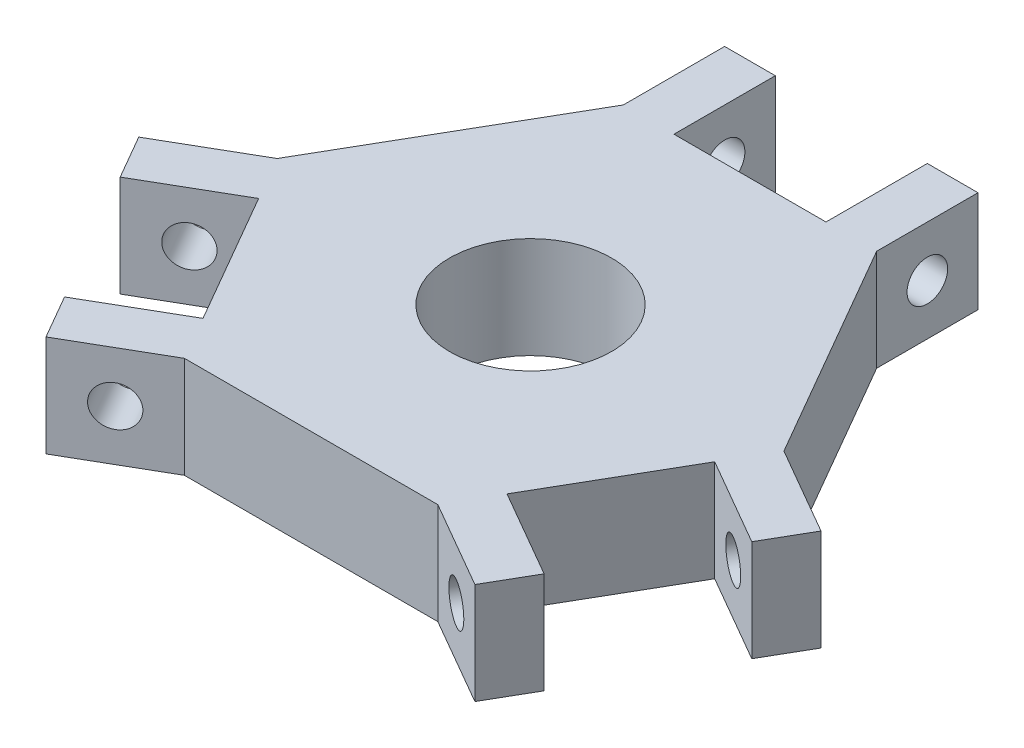
ISO-10303-21;
HEADER;
FILE_DESCRIPTION(('STEP AP214'),'2;1');
FILE_NAME('part.step','',(''),(''),'','','');
FILE_SCHEMA(('AUTOMOTIVE_DESIGN { 1 0 10303 214 1 1 1 1 }'));
ENDSEC;
DATA;
#1=APPLICATION_CONTEXT('core data for automotive mechanical design processes');
#2=APPLICATION_PROTOCOL_DEFINITION('international standard','automotive_design',2000,#1);
#3=PRODUCT_CONTEXT('',#1,'mechanical');
#4=PRODUCT('Part','Part','',(#3));
#5=PRODUCT_RELATED_PRODUCT_CATEGORY('part','',(#4));
#6=PRODUCT_DEFINITION_FORMATION('','',#4);
#7=PRODUCT_DEFINITION_CONTEXT('part definition',#1,'design');
#8=PRODUCT_DEFINITION('design','',#6,#7);
#9=PRODUCT_DEFINITION_SHAPE('','',#8);
#10=(LENGTH_UNIT() NAMED_UNIT(*) SI_UNIT(.MILLI.,.METRE.));
#11=(NAMED_UNIT(*) PLANE_ANGLE_UNIT() SI_UNIT($,.RADIAN.));
#12=(NAMED_UNIT(*) SI_UNIT($,.STERADIAN.) SOLID_ANGLE_UNIT());
#13=UNCERTAINTY_MEASURE_WITH_UNIT(LENGTH_MEASURE(1.E-05),#10,'distance_accuracy_value','');
#14=(GEOMETRIC_REPRESENTATION_CONTEXT(3) GLOBAL_UNCERTAINTY_ASSIGNED_CONTEXT((#13)) GLOBAL_UNIT_ASSIGNED_CONTEXT((#10,
#11,#12)) REPRESENTATION_CONTEXT('',''));
#15=CARTESIAN_POINT('',(0.,0.,0.));
#16=DIRECTION('',(0.,0.,1.));
#17=DIRECTION('',(1.,0.,0.));
#18=AXIS2_PLACEMENT_3D('',#15,#16,#17);
#19=CARTESIAN_POINT('',(18.75,5.,-10.8253175473055));
#20=DIRECTION('',(-0.866025403784439,0.,0.5));
#21=DIRECTION('',(0.5,0.,0.866025403784439));
#22=AXIS2_PLACEMENT_3D('',#19,#20,#21);
#23=PLANE('',#22);
#24=DIRECTION('',(-0.5,0.,-0.866025403784439));
#25=VECTOR('',#24,1.);
#26=CARTESIAN_POINT('',(18.75,-5.,-10.8253175473055));
#27=LINE('',#26,#25);
#28=CARTESIAN_POINT('',(25.,-5.,0.));
#29=VERTEX_POINT('',#28);
#30=CARTESIAN_POINT('',(12.5,-5.,-21.650635094611));
#31=VERTEX_POINT('',#30);
#32=EDGE_CURVE('E234',#29,#31,#27,.T.);
#33=ORIENTED_EDGE('',*,*,#32,.T.);
#34=DIRECTION('',(0.,-1.,0.));
#35=VECTOR('',#34,1.);
#36=CARTESIAN_POINT('',(12.5,5.,-21.650635094611));
#37=LINE('',#36,#35);
#38=CARTESIAN_POINT('',(12.5,5.,-21.650635094611));
#39=VERTEX_POINT('',#38);
#40=EDGE_CURVE('E11',#39,#31,#37,.T.);
#41=ORIENTED_EDGE('',*,*,#40,.F.);
#42=DIRECTION('',(-0.5,0.,-0.866025403784439));
#43=VECTOR('',#42,1.);
#44=CARTESIAN_POINT('',(18.75,5.,-10.8253175473055));
#45=LINE('',#44,#43);
#46=CARTESIAN_POINT('',(25.,5.,0.));
#47=VERTEX_POINT('',#46);
#48=EDGE_CURVE('E379',#47,#39,#45,.T.);
#49=ORIENTED_EDGE('',*,*,#48,.F.);
#50=DIRECTION('',(0.,-1.,0.));
#51=VECTOR('',#50,1.);
#52=CARTESIAN_POINT('',(25.,5.,0.));
#53=LINE('',#52,#51);
#54=EDGE_CURVE('E53',#47,#29,#53,.T.);
#55=ORIENTED_EDGE('',*,*,#54,.T.);
#56=EDGE_LOOP('',(#33,#41,#49,#55));
#57=FACE_BOUND('',#56,.T.);
#58=ADVANCED_FACE('F34',(#57),#23,.F.);
#59=CARTESIAN_POINT('',(12.5,5.,0.));
#60=DIRECTION('',(-1.,0.,0.));
#61=DIRECTION('',(0.,0.,1.));
#62=AXIS2_PLACEMENT_3D('',#59,#60,#61);
#63=PLANE('',#62);
#64=CARTESIAN_POINT('',(12.5,0.,-26.650635094611));
#65=DIRECTION('',(-1.,0.,0.));
#66=DIRECTION('',(0.,0.,1.));
#67=AXIS2_PLACEMENT_3D('',#64,#65,#66);
#68=CIRCLE('',#67,2.);
#69=CARTESIAN_POINT('',(12.5,0.,-24.650635094611));
#70=VERTEX_POINT('',#69);
#71=EDGE_CURVE('E235',#70,#70,#68,.T.);
#72=ORIENTED_EDGE('',*,*,#71,.T.);
#73=EDGE_LOOP('',(#72));
#74=FACE_BOUND('',#73,.T.);
#75=DIRECTION('',(0.,0.,-1.));
#76=VECTOR('',#75,1.);
#77=CARTESIAN_POINT('',(12.5,-5.,0.));
#78=LINE('',#77,#76);
#79=CARTESIAN_POINT('',(12.5,-5.,-31.650635094611));
#80=VERTEX_POINT('',#79);
#81=EDGE_CURVE('E237',#31,#80,#78,.T.);
#82=ORIENTED_EDGE('',*,*,#81,.T.);
#83=DIRECTION('',(0.,-1.,0.));
#84=VECTOR('',#83,1.);
#85=CARTESIAN_POINT('',(12.5,5.,-31.650635094611));
#86=LINE('',#85,#84);
#87=CARTESIAN_POINT('',(12.5,5.,-31.650635094611));
#88=VERTEX_POINT('',#87);
#89=EDGE_CURVE('E44',#88,#80,#86,.T.);
#90=ORIENTED_EDGE('',*,*,#89,.F.);
#91=DIRECTION('',(0.,0.,-1.));
#92=VECTOR('',#91,1.);
#93=CARTESIAN_POINT('',(12.5,5.,0.));
#94=LINE('',#93,#92);
#95=EDGE_CURVE('E139',#39,#88,#94,.T.);
#96=ORIENTED_EDGE('',*,*,#95,.F.);
#97=ORIENTED_EDGE('',*,*,#40,.T.);
#98=EDGE_LOOP('',(#82,#90,#96,#97));
#99=FACE_BOUND('',#98,.T.);
#100=ADVANCED_FACE('F451',(#74,#99),#63,.F.);
#101=CARTESIAN_POINT('',(0.,5.,-31.650635094611));
#102=DIRECTION('',(0.,0.,1.));
#103=DIRECTION('',(1.,0.,0.));
#104=AXIS2_PLACEMENT_3D('',#101,#102,#103);
#105=PLANE('',#104);
#106=DIRECTION('',(-1.,0.,0.));
#107=VECTOR('',#106,1.);
#108=CARTESIAN_POINT('',(0.,-5.,-31.650635094611));
#109=LINE('',#108,#107);
#110=CARTESIAN_POINT('',(7.5,-5.,-31.650635094611));
#111=VERTEX_POINT('',#110);
#112=EDGE_CURVE('E239',#80,#111,#109,.T.);
#113=ORIENTED_EDGE('',*,*,#112,.T.);
#114=DIRECTION('',(0.,-1.,0.));
#115=VECTOR('',#114,1.);
#116=CARTESIAN_POINT('',(7.5,5.,-31.650635094611));
#117=LINE('',#116,#115);
#118=CARTESIAN_POINT('',(7.5,5.,-31.650635094611));
#119=VERTEX_POINT('',#118);
#120=EDGE_CURVE('E339',#119,#111,#117,.T.);
#121=ORIENTED_EDGE('',*,*,#120,.F.);
#122=DIRECTION('',(-1.,0.,0.));
#123=VECTOR('',#122,1.);
#124=CARTESIAN_POINT('',(0.,5.,-31.650635094611));
#125=LINE('',#124,#123);
#126=EDGE_CURVE('E382',#88,#119,#125,.T.);
#127=ORIENTED_EDGE('',*,*,#126,.F.);
#128=ORIENTED_EDGE('',*,*,#89,.T.);
#129=EDGE_LOOP('',(#113,#121,#127,#128));
#130=FACE_BOUND('',#129,.T.);
#131=ADVANCED_FACE('F455',(#130),#105,.F.);
#132=CARTESIAN_POINT('',(7.5,5.,0.));
#133=DIRECTION('',(-1.,0.,0.));
#134=DIRECTION('',(0.,0.,1.));
#135=AXIS2_PLACEMENT_3D('',#132,#133,#134);
#136=PLANE('',#135);
#137=CARTESIAN_POINT('',(7.5,0.,-26.650635094611));
#138=DIRECTION('',(-1.,0.,0.));
#139=DIRECTION('',(0.,0.,1.));
#140=AXIS2_PLACEMENT_3D('',#137,#138,#139);
#141=CIRCLE('',#140,2.);
#142=CARTESIAN_POINT('',(7.5,0.,-24.650635094611));
#143=VERTEX_POINT('',#142);
#144=EDGE_CURVE('E372',#143,#143,#141,.T.);
#145=ORIENTED_EDGE('',*,*,#144,.F.);
#146=EDGE_LOOP('',(#145));
#147=FACE_BOUND('',#146,.T.);
#148=DIRECTION('',(0.,0.,-1.));
#149=VECTOR('',#148,1.);
#150=CARTESIAN_POINT('',(7.5,-5.,0.));
#151=LINE('',#150,#149);
#152=CARTESIAN_POINT('',(7.5,-5.,-21.650635094611));
#153=VERTEX_POINT('',#152);
#154=EDGE_CURVE('E242',#153,#111,#151,.T.);
#155=ORIENTED_EDGE('',*,*,#154,.F.);
#156=DIRECTION('',(0.,-1.,0.));
#157=VECTOR('',#156,1.);
#158=CARTESIAN_POINT('',(7.5,5.,-21.650635094611));
#159=LINE('',#158,#157);
#160=CARTESIAN_POINT('',(7.5,5.,-21.650635094611));
#161=VERTEX_POINT('',#160);
#162=EDGE_CURVE('E337',#161,#153,#159,.T.);
#163=ORIENTED_EDGE('',*,*,#162,.F.);
#164=DIRECTION('',(0.,0.,-1.));
#165=VECTOR('',#164,1.);
#166=CARTESIAN_POINT('',(7.5,5.,0.));
#167=LINE('',#166,#165);
#168=EDGE_CURVE('E384',#161,#119,#167,.T.);
#169=ORIENTED_EDGE('',*,*,#168,.T.);
#170=ORIENTED_EDGE('',*,*,#120,.T.);
#171=EDGE_LOOP('',(#155,#163,#169,#170));
#172=FACE_BOUND('',#171,.T.);
#173=ADVANCED_FACE('F461',(#147,#172),#136,.T.);
#174=CARTESIAN_POINT('',(0.,5.,-21.650635094611));
#175=DIRECTION('',(0.,0.,1.));
#176=DIRECTION('',(1.,0.,0.));
#177=AXIS2_PLACEMENT_3D('',#174,#175,#176);
#178=PLANE('',#177);
#179=DIRECTION('',(-1.,0.,0.));
#180=VECTOR('',#179,1.);
#181=CARTESIAN_POINT('',(0.,-5.,-21.650635094611));
#182=LINE('',#181,#180);
#183=CARTESIAN_POINT('',(-7.5,-5.,-21.650635094611));
#184=VERTEX_POINT('',#183);
#185=EDGE_CURVE('E245',#153,#184,#182,.T.);
#186=ORIENTED_EDGE('',*,*,#185,.T.);
#187=DIRECTION('',(0.,-1.,0.));
#188=VECTOR('',#187,1.);
#189=CARTESIAN_POINT('',(-7.5,5.,-21.650635094611));
#190=LINE('',#189,#188);
#191=CARTESIAN_POINT('',(-7.5,5.,-21.650635094611));
#192=VERTEX_POINT('',#191);
#193=EDGE_CURVE('E334',#192,#184,#190,.T.);
#194=ORIENTED_EDGE('',*,*,#193,.F.);
#195=DIRECTION('',(-1.,0.,0.));
#196=VECTOR('',#195,1.);
#197=CARTESIAN_POINT('',(0.,5.,-21.650635094611));
#198=LINE('',#197,#196);
#199=EDGE_CURVE('E387',#161,#192,#198,.T.);
#200=ORIENTED_EDGE('',*,*,#199,.F.);
#201=ORIENTED_EDGE('',*,*,#162,.T.);
#202=EDGE_LOOP('',(#186,#194,#200,#201));
#203=FACE_BOUND('',#202,.T.);
#204=ADVANCED_FACE('F465',(#203),#178,.F.);
#205=CARTESIAN_POINT('',(-7.5,5.,0.));
#206=DIRECTION('',(-1.,0.,0.));
#207=DIRECTION('',(0.,0.,1.));
#208=AXIS2_PLACEMENT_3D('',#205,#206,#207);
#209=PLANE('',#208);
#210=CARTESIAN_POINT('',(-7.5,0.,-26.650635094611));
#211=DIRECTION('',(-1.,0.,0.));
#212=DIRECTION('',(0.,0.,1.));
#213=AXIS2_PLACEMENT_3D('',#210,#211,#212);
#214=CIRCLE('',#213,2.);
#215=CARTESIAN_POINT('',(-7.5,0.,-24.650635094611));
#216=VERTEX_POINT('',#215);
#217=EDGE_CURVE('E345',#216,#216,#214,.T.);
#218=ORIENTED_EDGE('',*,*,#217,.T.);
#219=EDGE_LOOP('',(#218));
#220=FACE_BOUND('',#219,.T.);
#221=DIRECTION('',(0.,0.,-1.));
#222=VECTOR('',#221,1.);
#223=CARTESIAN_POINT('',(-7.5,-5.,0.));
#224=LINE('',#223,#222);
#225=CARTESIAN_POINT('',(-7.5,-5.,-31.650635094611));
#226=VERTEX_POINT('',#225);
#227=EDGE_CURVE('E247',#184,#226,#224,.T.);
#228=ORIENTED_EDGE('',*,*,#227,.T.);
#229=DIRECTION('',(0.,-1.,0.));
#230=VECTOR('',#229,1.);
#231=CARTESIAN_POINT('',(-7.5,5.,-31.650635094611));
#232=LINE('',#231,#230);
#233=CARTESIAN_POINT('',(-7.5,5.,-31.650635094611));
#234=VERTEX_POINT('',#233);
#235=EDGE_CURVE('E332',#234,#226,#232,.T.);
#236=ORIENTED_EDGE('',*,*,#235,.F.);
#237=DIRECTION('',(0.,0.,-1.));
#238=VECTOR('',#237,1.);
#239=CARTESIAN_POINT('',(-7.5,5.,0.));
#240=LINE('',#239,#238);
#241=EDGE_CURVE('E389',#192,#234,#240,.T.);
#242=ORIENTED_EDGE('',*,*,#241,.F.);
#243=ORIENTED_EDGE('',*,*,#193,.T.);
#244=EDGE_LOOP('',(#228,#236,#242,#243));
#245=FACE_BOUND('',#244,.T.);
#246=ADVANCED_FACE('F469',(#220,#245),#209,.F.);
#247=CARTESIAN_POINT('',(0.,5.,-31.650635094611));
#248=DIRECTION('',(0.,0.,-1.));
#249=DIRECTION('',(-1.,0.,0.));
#250=AXIS2_PLACEMENT_3D('',#247,#248,#249);
#251=PLANE('',#250);
#252=DIRECTION('',(1.,0.,0.));
#253=VECTOR('',#252,1.);
#254=CARTESIAN_POINT('',(0.,-5.,-31.650635094611));
#255=LINE('',#254,#253);
#256=CARTESIAN_POINT('',(-12.5,-5.,-31.650635094611));
#257=VERTEX_POINT('',#256);
#258=EDGE_CURVE('E250',#257,#226,#255,.T.);
#259=ORIENTED_EDGE('',*,*,#258,.F.);
#260=DIRECTION('',(0.,-1.,0.));
#261=VECTOR('',#260,1.);
#262=CARTESIAN_POINT('',(-12.5,5.,-31.650635094611));
#263=LINE('',#262,#261);
#264=CARTESIAN_POINT('',(-12.5,5.,-31.650635094611));
#265=VERTEX_POINT('',#264);
#266=EDGE_CURVE('E330',#265,#257,#263,.T.);
#267=ORIENTED_EDGE('',*,*,#266,.F.);
#268=DIRECTION('',(1.,0.,0.));
#269=VECTOR('',#268,1.);
#270=CARTESIAN_POINT('',(0.,5.,-31.650635094611));
#271=LINE('',#270,#269);
#272=EDGE_CURVE('E391',#265,#234,#271,.T.);
#273=ORIENTED_EDGE('',*,*,#272,.T.);
#274=ORIENTED_EDGE('',*,*,#235,.T.);
#275=EDGE_LOOP('',(#259,#267,#273,#274));
#276=FACE_BOUND('',#275,.T.);
#277=ADVANCED_FACE('F473',(#276),#251,.T.);
#278=CARTESIAN_POINT('',(-12.5,5.,0.));
#279=DIRECTION('',(-1.,0.,0.));
#280=DIRECTION('',(0.,0.,1.));
#281=AXIS2_PLACEMENT_3D('',#278,#279,#280);
#282=PLANE('',#281);
#283=CARTESIAN_POINT('',(-12.5,0.,-26.650635094611));
#284=DIRECTION('',(-1.,0.,0.));
#285=DIRECTION('',(0.,0.,1.));
#286=AXIS2_PLACEMENT_3D('',#283,#284,#285);
#287=CIRCLE('',#286,2.);
#288=CARTESIAN_POINT('',(-12.5,0.,-24.650635094611));
#289=VERTEX_POINT('',#288);
#290=EDGE_CURVE('E343',#289,#289,#287,.T.);
#291=ORIENTED_EDGE('',*,*,#290,.F.);
#292=EDGE_LOOP('',(#291));
#293=FACE_BOUND('',#292,.T.);
#294=DIRECTION('',(0.,0.,-1.));
#295=VECTOR('',#294,1.);
#296=CARTESIAN_POINT('',(-12.5,-5.,0.));
#297=LINE('',#296,#295);
#298=CARTESIAN_POINT('',(-12.5,-5.,-21.650635094611));
#299=VERTEX_POINT('',#298);
#300=EDGE_CURVE('E253',#299,#257,#297,.T.);
#301=ORIENTED_EDGE('',*,*,#300,.F.);
#302=DIRECTION('',(0.,-1.,0.));
#303=VECTOR('',#302,1.);
#304=CARTESIAN_POINT('',(-12.5,5.,-21.650635094611));
#305=LINE('',#304,#303);
#306=CARTESIAN_POINT('',(-12.5,5.,-21.650635094611));
#307=VERTEX_POINT('',#306);
#308=EDGE_CURVE('E328',#307,#299,#305,.T.);
#309=ORIENTED_EDGE('',*,*,#308,.F.);
#310=DIRECTION('',(0.,0.,-1.));
#311=VECTOR('',#310,1.);
#312=CARTESIAN_POINT('',(-12.5,5.,0.));
#313=LINE('',#312,#311);
#314=EDGE_CURVE('E394',#307,#265,#313,.T.);
#315=ORIENTED_EDGE('',*,*,#314,.T.);
#316=ORIENTED_EDGE('',*,*,#266,.T.);
#317=EDGE_LOOP('',(#301,#309,#315,#316));
#318=FACE_BOUND('',#317,.T.);
#319=ADVANCED_FACE('F477',(#293,#318),#282,.T.);
#320=CARTESIAN_POINT('',(-18.75,5.,-10.8253175473055));
#321=DIRECTION('',(0.866025403784439,0.,0.5));
#322=DIRECTION('',(0.5,0.,-0.866025403784439));
#323=AXIS2_PLACEMENT_3D('',#320,#321,#322);
#324=PLANE('',#323);
#325=DIRECTION('',(-0.5,0.,0.866025403784439));
#326=VECTOR('',#325,1.);
#327=CARTESIAN_POINT('',(-18.75,-5.,-10.8253175473055));
#328=LINE('',#327,#326);
#329=CARTESIAN_POINT('',(-25.,-5.,0.));
#330=VERTEX_POINT('',#329);
#331=EDGE_CURVE('E256',#299,#330,#328,.T.);
#332=ORIENTED_EDGE('',*,*,#331,.T.);
#333=DIRECTION('',(0.,-1.,0.));
#334=VECTOR('',#333,1.);
#335=CARTESIAN_POINT('',(-25.,5.,0.));
#336=LINE('',#335,#334);
#337=CARTESIAN_POINT('',(-25.,5.,0.));
#338=VERTEX_POINT('',#337);
#339=EDGE_CURVE('E325',#338,#330,#336,.T.);
#340=ORIENTED_EDGE('',*,*,#339,.F.);
#341=DIRECTION('',(-0.5,0.,0.866025403784439));
#342=VECTOR('',#341,1.);
#343=CARTESIAN_POINT('',(-18.75,5.,-10.8253175473055));
#344=LINE('',#343,#342);
#345=EDGE_CURVE('E397',#307,#338,#344,.T.);
#346=ORIENTED_EDGE('',*,*,#345,.F.);
#347=ORIENTED_EDGE('',*,*,#308,.T.);
#348=EDGE_LOOP('',(#332,#340,#346,#347));
#349=FACE_BOUND('',#348,.T.);
#350=ADVANCED_FACE('F481',(#349),#324,.F.);
#351=CARTESIAN_POINT('',(-6.25,5.,-10.8253175473055));
#352=DIRECTION('',(0.5,0.,0.866025403784438));
#353=DIRECTION('',(0.866025403784438,0.,-0.5));
#354=AXIS2_PLACEMENT_3D('',#351,#352,#353);
#355=PLANE('',#354);
#356=CARTESIAN_POINT('',(-29.3301270189221,0.,2.49999999999995));
#357=DIRECTION('',(0.5,0.,0.866025403784438));
#358=DIRECTION('',(0.866025403784438,0.,-0.5));
#359=AXIS2_PLACEMENT_3D('',#356,#357,#358);
#360=CIRCLE('',#359,2.);
#361=CARTESIAN_POINT('',(-27.5980762113532,0.,1.49999999999995));
#362=VERTEX_POINT('',#361);
#363=EDGE_CURVE('E350',#362,#362,#360,.T.);
#364=ORIENTED_EDGE('',*,*,#363,.T.);
#365=EDGE_LOOP('',(#364));
#366=FACE_BOUND('',#365,.T.);
#367=DIRECTION('',(-0.866025403784438,0.,0.5));
#368=VECTOR('',#367,1.);
#369=CARTESIAN_POINT('',(-6.25,-5.,-10.8253175473055));
#370=LINE('',#369,#368);
#371=CARTESIAN_POINT('',(-33.6602540378444,-5.,5.00000000000002));
#372=VERTEX_POINT('',#371);
#373=EDGE_CURVE('E258',#330,#372,#370,.T.);
#374=ORIENTED_EDGE('',*,*,#373,.T.);
#375=DIRECTION('',(0.,-1.,0.));
#376=VECTOR('',#375,1.);
#377=CARTESIAN_POINT('',(-33.6602540378444,5.,5.00000000000002));
#378=LINE('',#377,#376);
#379=CARTESIAN_POINT('',(-33.6602540378444,5.,5.00000000000002));
#380=VERTEX_POINT('',#379);
#381=EDGE_CURVE('E322',#380,#372,#378,.T.);
#382=ORIENTED_EDGE('',*,*,#381,.F.);
#383=DIRECTION('',(-0.866025403784438,0.,0.5));
#384=VECTOR('',#383,1.);
#385=CARTESIAN_POINT('',(-6.25,5.,-10.8253175473055));
#386=LINE('',#385,#384);
#387=EDGE_CURVE('E399',#338,#380,#386,.T.);
#388=ORIENTED_EDGE('',*,*,#387,.F.);
#389=ORIENTED_EDGE('',*,*,#339,.T.);
#390=EDGE_LOOP('',(#374,#382,#388,#389));
#391=FACE_BOUND('',#390,.T.);
#392=ADVANCED_FACE('F485',(#366,#391),#355,.F.);
#393=CARTESIAN_POINT('',(-27.4102540378444,5.,15.8253175473055));
#394=DIRECTION('',(0.866025403784438,0.,-0.5));
#395=DIRECTION('',(-0.5,0.,-0.866025403784438));
#396=AXIS2_PLACEMENT_3D('',#393,#394,#395);
#397=PLANE('',#396);
#398=DIRECTION('',(0.5,0.,0.866025403784438));
#399=VECTOR('',#398,1.);
#400=CARTESIAN_POINT('',(-27.4102540378444,-5.,15.8253175473055));
#401=LINE('',#400,#399);
#402=CARTESIAN_POINT('',(-31.1602540378444,-5.,9.33012701892221));
#403=VERTEX_POINT('',#402);
#404=EDGE_CURVE('E260',#372,#403,#401,.T.);
#405=ORIENTED_EDGE('',*,*,#404,.T.);
#406=DIRECTION('',(0.,-1.,0.));
#407=VECTOR('',#406,1.);
#408=CARTESIAN_POINT('',(-31.1602540378444,5.,9.33012701892221));
#409=LINE('',#408,#407);
#410=CARTESIAN_POINT('',(-31.1602540378444,5.,9.33012701892221));
#411=VERTEX_POINT('',#410);
#412=EDGE_CURVE('E320',#411,#403,#409,.T.);
#413=ORIENTED_EDGE('',*,*,#412,.F.);
#414=DIRECTION('',(0.5,0.,0.866025403784438));
#415=VECTOR('',#414,1.);
#416=CARTESIAN_POINT('',(-27.4102540378444,5.,15.8253175473055));
#417=LINE('',#416,#415);
#418=EDGE_CURVE('E401',#380,#411,#417,.T.);
#419=ORIENTED_EDGE('',*,*,#418,.F.);
#420=ORIENTED_EDGE('',*,*,#381,.T.);
#421=EDGE_LOOP('',(#405,#413,#419,#420));
#422=FACE_BOUND('',#421,.T.);
#423=ADVANCED_FACE('F489',(#422),#397,.F.);
#424=CARTESIAN_POINT('',(-3.75000000000001,5.,-6.4951905283833));
#425=DIRECTION('',(0.500000000000001,0.,0.866025403784438));
#426=DIRECTION('',(0.866025403784438,0.,-0.500000000000001));
#427=AXIS2_PLACEMENT_3D('',#424,#425,#426);
#428=PLANE('',#427);
#429=CARTESIAN_POINT('',(-26.8301270189221,0.,6.83012701892217));
#430=DIRECTION('',(0.500000000000001,0.,0.866025403784438));
#431=DIRECTION('',(0.866025403784438,0.,-0.500000000000001));
#432=AXIS2_PLACEMENT_3D('',#429,#430,#431);
#433=CIRCLE('',#432,2.);
#434=CARTESIAN_POINT('',(-25.0980762113532,0.,5.83012701892217));
#435=VERTEX_POINT('',#434);
#436=EDGE_CURVE('E357',#435,#435,#433,.T.);
#437=ORIENTED_EDGE('',*,*,#436,.F.);
#438=EDGE_LOOP('',(#437));
#439=FACE_BOUND('',#438,.T.);
#440=DIRECTION('',(-0.866025403784438,0.,0.500000000000001));
#441=VECTOR('',#440,1.);
#442=CARTESIAN_POINT('',(-3.75000000000001,-5.,-6.4951905283833));
#443=LINE('',#442,#441);
#444=CARTESIAN_POINT('',(-22.5,-5.,4.33012701892219));
#445=VERTEX_POINT('',#444);
#446=EDGE_CURVE('E263',#445,#403,#443,.T.);
#447=ORIENTED_EDGE('',*,*,#446,.F.);
#448=DIRECTION('',(0.,-1.,0.));
#449=VECTOR('',#448,1.);
#450=CARTESIAN_POINT('',(-22.5,5.,4.33012701892219));
#451=LINE('',#450,#449);
#452=CARTESIAN_POINT('',(-22.5,5.,4.33012701892219));
#453=VERTEX_POINT('',#452);
#454=EDGE_CURVE('E318',#453,#445,#451,.T.);
#455=ORIENTED_EDGE('',*,*,#454,.F.);
#456=DIRECTION('',(-0.866025403784438,0.,0.500000000000001));
#457=VECTOR('',#456,1.);
#458=CARTESIAN_POINT('',(-3.75000000000001,5.,-6.4951905283833));
#459=LINE('',#458,#457);
#460=EDGE_CURVE('E403',#453,#411,#459,.T.);
#461=ORIENTED_EDGE('',*,*,#460,.T.);
#462=ORIENTED_EDGE('',*,*,#412,.T.);
#463=EDGE_LOOP('',(#447,#455,#461,#462));
#464=FACE_BOUND('',#463,.T.);
#465=ADVANCED_FACE('F492',(#439,#464),#428,.T.);
#466=CARTESIAN_POINT('',(-18.75,5.,10.8253175473055));
#467=DIRECTION('',(0.866025403784439,0.,-0.5));
#468=DIRECTION('',(-0.5,0.,-0.866025403784439));
#469=AXIS2_PLACEMENT_3D('',#466,#467,#468);
#470=PLANE('',#469);
#471=DIRECTION('',(0.5,0.,0.866025403784439));
#472=VECTOR('',#471,1.);
#473=CARTESIAN_POINT('',(-18.75,-5.,10.8253175473055));
#474=LINE('',#473,#472);
#475=CARTESIAN_POINT('',(-15.,-5.,17.3205080756888));
#476=VERTEX_POINT('',#475);
#477=EDGE_CURVE('E266',#445,#476,#474,.T.);
#478=ORIENTED_EDGE('',*,*,#477,.T.);
#479=DIRECTION('',(0.,-1.,0.));
#480=VECTOR('',#479,1.);
#481=CARTESIAN_POINT('',(-15.,5.,17.3205080756888));
#482=LINE('',#481,#480);
#483=CARTESIAN_POINT('',(-15.,5.,17.3205080756888));
#484=VERTEX_POINT('',#483);
#485=EDGE_CURVE('E315',#484,#476,#482,.T.);
#486=ORIENTED_EDGE('',*,*,#485,.F.);
#487=DIRECTION('',(0.5,0.,0.866025403784439));
#488=VECTOR('',#487,1.);
#489=CARTESIAN_POINT('',(-18.75,5.,10.8253175473055));
#490=LINE('',#489,#488);
#491=EDGE_CURVE('E406',#453,#484,#490,.T.);
#492=ORIENTED_EDGE('',*,*,#491,.F.);
#493=ORIENTED_EDGE('',*,*,#454,.T.);
#494=EDGE_LOOP('',(#478,#486,#492,#493));
#495=FACE_BOUND('',#494,.T.);
#496=ADVANCED_FACE('F496',(#495),#470,.F.);
#497=CARTESIAN_POINT('',(3.75,5.,6.49519052838327));
#498=DIRECTION('',(0.500000000000001,0.,0.866025403784438));
#499=DIRECTION('',(0.866025403784438,0.,-0.500000000000001));
#500=AXIS2_PLACEMENT_3D('',#497,#498,#499);
#501=PLANE('',#500);
#502=CARTESIAN_POINT('',(-19.3301270189222,0.,19.8205080756888));
#503=DIRECTION('',(0.500000000000001,0.,0.866025403784438));
#504=DIRECTION('',(0.866025403784438,0.,-0.500000000000001));
#505=AXIS2_PLACEMENT_3D('',#502,#503,#504);
#506=CIRCLE('',#505,2.);
#507=CARTESIAN_POINT('',(-17.5980762113534,0.,18.8205080756888));
#508=VERTEX_POINT('',#507);
#509=EDGE_CURVE('E362',#508,#508,#506,.T.);
#510=ORIENTED_EDGE('',*,*,#509,.T.);
#511=EDGE_LOOP('',(#510));
#512=FACE_BOUND('',#511,.T.);
#513=DIRECTION('',(-0.866025403784438,0.,0.500000000000001));
#514=VECTOR('',#513,1.);
#515=CARTESIAN_POINT('',(3.75,-5.,6.49519052838327));
#516=LINE('',#515,#514);
#517=CARTESIAN_POINT('',(-23.6602540378444,-5.,22.3205080756888));
#518=VERTEX_POINT('',#517);
#519=EDGE_CURVE('E268',#476,#518,#516,.T.);
#520=ORIENTED_EDGE('',*,*,#519,.T.);
#521=DIRECTION('',(0.,-1.,0.));
#522=VECTOR('',#521,1.);
#523=CARTESIAN_POINT('',(-23.6602540378444,5.,22.3205080756888));
#524=LINE('',#523,#522);
#525=CARTESIAN_POINT('',(-23.6602540378444,5.,22.3205080756888));
#526=VERTEX_POINT('',#525);
#527=EDGE_CURVE('E313',#526,#518,#524,.T.);
#528=ORIENTED_EDGE('',*,*,#527,.F.);
#529=DIRECTION('',(-0.866025403784438,0.,0.500000000000001));
#530=VECTOR('',#529,1.);
#531=CARTESIAN_POINT('',(3.75,5.,6.49519052838327));
#532=LINE('',#531,#530);
#533=EDGE_CURVE('E408',#484,#526,#532,.T.);
#534=ORIENTED_EDGE('',*,*,#533,.F.);
#535=ORIENTED_EDGE('',*,*,#485,.T.);
#536=EDGE_LOOP('',(#520,#528,#534,#535));
#537=FACE_BOUND('',#536,.T.);
#538=ADVANCED_FACE('F500',(#512,#537),#501,.F.);
#539=CARTESIAN_POINT('',(-27.4102540378444,5.,15.8253175473055));
#540=DIRECTION('',(-0.866025403784438,0.,0.500000000000001));
#541=DIRECTION('',(0.500000000000001,0.,0.866025403784438));
#542=AXIS2_PLACEMENT_3D('',#539,#540,#541);
#543=PLANE('',#542);
#544=DIRECTION('',(-0.500000000000001,0.,-0.866025403784438));
#545=VECTOR('',#544,1.);
#546=CARTESIAN_POINT('',(-27.4102540378444,-5.,15.8253175473055));
#547=LINE('',#546,#545);
#548=CARTESIAN_POINT('',(-21.1602540378444,-5.,26.650635094611));
#549=VERTEX_POINT('',#548);
#550=EDGE_CURVE('E271',#549,#518,#547,.T.);
#551=ORIENTED_EDGE('',*,*,#550,.F.);
#552=DIRECTION('',(0.,-1.,0.));
#553=VECTOR('',#552,1.);
#554=CARTESIAN_POINT('',(-21.1602540378444,5.,26.650635094611));
#555=LINE('',#554,#553);
#556=CARTESIAN_POINT('',(-21.1602540378444,5.,26.650635094611));
#557=VERTEX_POINT('',#556);
#558=EDGE_CURVE('E311',#557,#549,#555,.T.);
#559=ORIENTED_EDGE('',*,*,#558,.F.);
#560=DIRECTION('',(-0.500000000000001,0.,-0.866025403784438));
#561=VECTOR('',#560,1.);
#562=CARTESIAN_POINT('',(-27.4102540378444,5.,15.8253175473055));
#563=LINE('',#562,#561);
#564=EDGE_CURVE('E410',#557,#526,#563,.T.);
#565=ORIENTED_EDGE('',*,*,#564,.T.);
#566=ORIENTED_EDGE('',*,*,#527,.T.);
#567=EDGE_LOOP('',(#551,#559,#565,#566));
#568=FACE_BOUND('',#567,.T.);
#569=ADVANCED_FACE('F504',(#568),#543,.T.);
#570=CARTESIAN_POINT('',(6.25000000000001,5.,10.8253175473055));
#571=DIRECTION('',(0.500000000000001,0.,0.866025403784438));
#572=DIRECTION('',(0.866025403784438,0.,-0.500000000000001));
#573=AXIS2_PLACEMENT_3D('',#570,#571,#572);
#574=PLANE('',#573);
#575=CARTESIAN_POINT('',(-16.8301270189223,0.,24.150635094611));
#576=DIRECTION('',(0.500000000000001,0.,0.866025403784438));
#577=DIRECTION('',(0.866025403784438,0.,-0.500000000000001));
#578=AXIS2_PLACEMENT_3D('',#575,#576,#577);
#579=CIRCLE('',#578,2.);
#580=CARTESIAN_POINT('',(-15.0980762113534,0.,23.150635094611));
#581=VERTEX_POINT('',#580);
#582=EDGE_CURVE('E38',#581,#581,#579,.T.);
#583=ORIENTED_EDGE('',*,*,#582,.F.);
#584=EDGE_LOOP('',(#583));
#585=FACE_BOUND('',#584,.T.);
#586=DIRECTION('',(-0.866025403784438,0.,0.500000000000001));
#587=VECTOR('',#586,1.);
#588=CARTESIAN_POINT('',(6.25000000000001,-5.,10.8253175473055));
#589=LINE('',#588,#587);
#590=CARTESIAN_POINT('',(-12.5,-5.,21.650635094611));
#591=VERTEX_POINT('',#590);
#592=EDGE_CURVE('E274',#591,#549,#589,.T.);
#593=ORIENTED_EDGE('',*,*,#592,.F.);
#594=DIRECTION('',(0.,-1.,0.));
#595=VECTOR('',#594,1.);
#596=CARTESIAN_POINT('',(-12.5,5.,21.650635094611));
#597=LINE('',#596,#595);
#598=CARTESIAN_POINT('',(-12.5,5.,21.650635094611));
#599=VERTEX_POINT('',#598);
#600=EDGE_CURVE('E309',#599,#591,#597,.T.);
#601=ORIENTED_EDGE('',*,*,#600,.F.);
#602=DIRECTION('',(-0.866025403784438,0.,0.500000000000001));
#603=VECTOR('',#602,1.);
#604=CARTESIAN_POINT('',(6.25000000000001,5.,10.8253175473055));
#605=LINE('',#604,#603);
#606=EDGE_CURVE('E413',#599,#557,#605,.T.);
#607=ORIENTED_EDGE('',*,*,#606,.T.);
#608=ORIENTED_EDGE('',*,*,#558,.T.);
#609=EDGE_LOOP('',(#593,#601,#607,#608));
#610=FACE_BOUND('',#609,.T.);
#611=ADVANCED_FACE('F508',(#585,#610),#574,.T.);
#612=CARTESIAN_POINT('',(0.,5.,21.650635094611));
#613=DIRECTION('',(0.,0.,-1.));
#614=DIRECTION('',(-1.,0.,0.));
#615=AXIS2_PLACEMENT_3D('',#612,#613,#614);
#616=PLANE('',#615);
#617=DIRECTION('',(1.,0.,0.));
#618=VECTOR('',#617,1.);
#619=CARTESIAN_POINT('',(0.,-5.,21.650635094611));
#620=LINE('',#619,#618);
#621=CARTESIAN_POINT('',(12.5,-5.,21.650635094611));
#622=VERTEX_POINT('',#621);
#623=EDGE_CURVE('E277',#591,#622,#620,.T.);
#624=ORIENTED_EDGE('',*,*,#623,.T.);
#625=DIRECTION('',(0.,-1.,0.));
#626=VECTOR('',#625,1.);
#627=CARTESIAN_POINT('',(12.5,5.,21.650635094611));
#628=LINE('',#627,#626);
#629=CARTESIAN_POINT('',(12.5,5.,21.650635094611));
#630=VERTEX_POINT('',#629);
#631=EDGE_CURVE('E306',#630,#622,#628,.T.);
#632=ORIENTED_EDGE('',*,*,#631,.F.);
#633=DIRECTION('',(1.,0.,0.));
#634=VECTOR('',#633,1.);
#635=CARTESIAN_POINT('',(0.,5.,21.650635094611));
#636=LINE('',#635,#634);
#637=EDGE_CURVE('E416',#599,#630,#636,.T.);
#638=ORIENTED_EDGE('',*,*,#637,.F.);
#639=ORIENTED_EDGE('',*,*,#600,.T.);
#640=EDGE_LOOP('',(#624,#632,#638,#639));
#641=FACE_BOUND('',#640,.T.);
#642=ADVANCED_FACE('F512',(#641),#616,.F.);
#643=CARTESIAN_POINT('',(-6.25,5.,10.8253175473055));
#644=DIRECTION('',(0.5,0.,-0.866025403784439));
#645=DIRECTION('',(-0.866025403784439,0.,-0.5));
#646=AXIS2_PLACEMENT_3D('',#643,#644,#645);
#647=PLANE('',#646);
#648=CARTESIAN_POINT('',(16.8301270189221,0.,24.1506350946109));
#649=DIRECTION('',(0.5,0.,-0.866025403784439));
#650=DIRECTION('',(-0.866025403784439,0.,-0.5));
#651=AXIS2_PLACEMENT_3D('',#648,#649,#650);
#652=CIRCLE('',#651,2.);
#653=CARTESIAN_POINT('',(15.0980762113533,0.,23.1506350946109));
#654=VERTEX_POINT('',#653);
#655=EDGE_CURVE('E346',#654,#654,#652,.T.);
#656=ORIENTED_EDGE('',*,*,#655,.T.);
#657=EDGE_LOOP('',(#656));
#658=FACE_BOUND('',#657,.T.);
#659=DIRECTION('',(0.866025403784439,0.,0.5));
#660=VECTOR('',#659,1.);
#661=CARTESIAN_POINT('',(-6.25,-5.,10.8253175473055));
#662=LINE('',#661,#660);
#663=CARTESIAN_POINT('',(21.1602540378444,-5.,26.650635094611));
#664=VERTEX_POINT('',#663);
#665=EDGE_CURVE('E279',#622,#664,#662,.T.);
#666=ORIENTED_EDGE('',*,*,#665,.T.);
#667=DIRECTION('',(0.,-1.,0.));
#668=VECTOR('',#667,1.);
#669=CARTESIAN_POINT('',(21.1602540378444,5.,26.650635094611));
#670=LINE('',#669,#668);
#671=CARTESIAN_POINT('',(21.1602540378444,5.,26.650635094611));
#672=VERTEX_POINT('',#671);
#673=EDGE_CURVE('E303',#672,#664,#670,.T.);
#674=ORIENTED_EDGE('',*,*,#673,.F.);
#675=DIRECTION('',(0.866025403784439,0.,0.5));
#676=VECTOR('',#675,1.);
#677=CARTESIAN_POINT('',(-6.25,5.,10.8253175473055));
#678=LINE('',#677,#676);
#679=EDGE_CURVE('E418',#630,#672,#678,.T.);
#680=ORIENTED_EDGE('',*,*,#679,.F.);
#681=ORIENTED_EDGE('',*,*,#631,.T.);
#682=EDGE_LOOP('',(#666,#674,#680,#681));
#683=FACE_BOUND('',#682,.T.);
#684=ADVANCED_FACE('F516',(#658,#683),#647,.F.);
#685=CARTESIAN_POINT('',(27.4102540378444,5.,15.8253175473055));
#686=DIRECTION('',(-0.866025403784439,0.,-0.5));
#687=DIRECTION('',(-0.5,0.,0.866025403784439));
#688=AXIS2_PLACEMENT_3D('',#685,#686,#687);
#689=PLANE('',#688);
#690=DIRECTION('',(0.5,0.,-0.866025403784439));
#691=VECTOR('',#690,1.);
#692=CARTESIAN_POINT('',(27.4102540378444,-5.,15.8253175473055));
#693=LINE('',#692,#691);
#694=CARTESIAN_POINT('',(23.6602540378444,-5.,22.3205080756888));
#695=VERTEX_POINT('',#694);
#696=EDGE_CURVE('E281',#664,#695,#693,.T.);
#697=ORIENTED_EDGE('',*,*,#696,.T.);
#698=DIRECTION('',(0.,-1.,0.));
#699=VECTOR('',#698,1.);
#700=CARTESIAN_POINT('',(23.6602540378444,5.,22.3205080756888));
#701=LINE('',#700,#699);
#702=CARTESIAN_POINT('',(23.6602540378444,5.,22.3205080756888));
#703=VERTEX_POINT('',#702);
#704=EDGE_CURVE('E301',#703,#695,#701,.T.);
#705=ORIENTED_EDGE('',*,*,#704,.F.);
#706=DIRECTION('',(0.5,0.,-0.866025403784439));
#707=VECTOR('',#706,1.);
#708=CARTESIAN_POINT('',(27.4102540378444,5.,15.8253175473055));
#709=LINE('',#708,#707);
#710=EDGE_CURVE('E420',#672,#703,#709,.T.);
#711=ORIENTED_EDGE('',*,*,#710,.F.);
#712=ORIENTED_EDGE('',*,*,#673,.T.);
#713=EDGE_LOOP('',(#697,#705,#711,#712));
#714=FACE_BOUND('',#713,.T.);
#715=ADVANCED_FACE('F432',(#714),#689,.F.);
#716=CARTESIAN_POINT('',(-3.75,5.,6.4951905283833));
#717=DIRECTION('',(0.5,0.,-0.866025403784439));
#718=DIRECTION('',(-0.866025403784439,0.,-0.5));
#719=AXIS2_PLACEMENT_3D('',#716,#717,#718);
#720=PLANE('',#719);
#721=CARTESIAN_POINT('',(19.3301270189222,0.,19.8205080756887));
#722=DIRECTION('',(0.5,0.,-0.866025403784439));
#723=DIRECTION('',(-0.866025403784439,0.,-0.5));
#724=AXIS2_PLACEMENT_3D('',#721,#722,#723);
#725=CIRCLE('',#724,2.);
#726=CARTESIAN_POINT('',(17.5980762113533,0.,18.8205080756887));
#727=VERTEX_POINT('',#726);
#728=EDGE_CURVE('E354',#727,#727,#725,.T.);
#729=ORIENTED_EDGE('',*,*,#728,.F.);
#730=EDGE_LOOP('',(#729));
#731=FACE_BOUND('',#730,.T.);
#732=DIRECTION('',(0.866025403784439,0.,0.5));
#733=VECTOR('',#732,1.);
#734=CARTESIAN_POINT('',(-3.75,-5.,6.4951905283833));
#735=LINE('',#734,#733);
#736=CARTESIAN_POINT('',(15.,-5.,17.3205080756888));
#737=VERTEX_POINT('',#736);
#738=EDGE_CURVE('E284',#737,#695,#735,.T.);
#739=ORIENTED_EDGE('',*,*,#738,.F.);
#740=DIRECTION('',(0.,-1.,0.));
#741=VECTOR('',#740,1.);
#742=CARTESIAN_POINT('',(15.,5.,17.3205080756888));
#743=LINE('',#742,#741);
#744=CARTESIAN_POINT('',(15.,5.,17.3205080756888));
#745=VERTEX_POINT('',#744);
#746=EDGE_CURVE('E299',#745,#737,#743,.T.);
#747=ORIENTED_EDGE('',*,*,#746,.F.);
#748=DIRECTION('',(0.866025403784439,0.,0.5));
#749=VECTOR('',#748,1.);
#750=CARTESIAN_POINT('',(-3.75,5.,6.4951905283833));
#751=LINE('',#750,#749);
#752=EDGE_CURVE('E422',#745,#703,#751,.T.);
#753=ORIENTED_EDGE('',*,*,#752,.T.);
#754=ORIENTED_EDGE('',*,*,#704,.T.);
#755=EDGE_LOOP('',(#739,#747,#753,#754));
#756=FACE_BOUND('',#755,.T.);
#757=ADVANCED_FACE('F426',(#731,#756),#720,.T.);
#758=CARTESIAN_POINT('',(18.75,5.,10.8253175473055));
#759=DIRECTION('',(-0.866025403784439,0.,-0.5));
#760=DIRECTION('',(-0.5,0.,0.866025403784439));
#761=AXIS2_PLACEMENT_3D('',#758,#759,#760);
#762=PLANE('',#761);
#763=DIRECTION('',(0.5,0.,-0.866025403784439));
#764=VECTOR('',#763,1.);
#765=CARTESIAN_POINT('',(18.75,-5.,10.8253175473055));
#766=LINE('',#765,#764);
#767=CARTESIAN_POINT('',(22.5,-5.,4.33012701892218));
#768=VERTEX_POINT('',#767);
#769=EDGE_CURVE('E287',#737,#768,#766,.T.);
#770=ORIENTED_EDGE('',*,*,#769,.T.);
#771=DIRECTION('',(0.,-1.,0.));
#772=VECTOR('',#771,1.);
#773=CARTESIAN_POINT('',(22.5,5.,4.33012701892218));
#774=LINE('',#773,#772);
#775=CARTESIAN_POINT('',(22.5,5.,4.33012701892218));
#776=VERTEX_POINT('',#775);
#777=EDGE_CURVE('E223',#776,#768,#774,.T.);
#778=ORIENTED_EDGE('',*,*,#777,.F.);
#779=DIRECTION('',(0.5,0.,-0.866025403784439));
#780=VECTOR('',#779,1.);
#781=CARTESIAN_POINT('',(18.75,5.,10.8253175473055));
#782=LINE('',#781,#780);
#783=EDGE_CURVE('E211',#745,#776,#782,.T.);
#784=ORIENTED_EDGE('',*,*,#783,.F.);
#785=ORIENTED_EDGE('',*,*,#746,.T.);
#786=EDGE_LOOP('',(#770,#778,#784,#785));
#787=FACE_BOUND('',#786,.T.);
#788=ADVANCED_FACE('F439',(#787),#762,.F.);
#789=CARTESIAN_POINT('',(3.75,5.,-6.49519052838329));
#790=DIRECTION('',(0.5,0.,-0.866025403784439));
#791=DIRECTION('',(-0.866025403784439,0.,-0.5));
#792=AXIS2_PLACEMENT_3D('',#789,#790,#791);
#793=PLANE('',#792);
#794=CARTESIAN_POINT('',(26.8301270189222,0.,6.8301270189222));
#795=DIRECTION('',(0.5,0.,-0.866025403784439));
#796=DIRECTION('',(-0.866025403784439,0.,-0.5));
#797=AXIS2_PLACEMENT_3D('',#794,#795,#796);
#798=CIRCLE('',#797,2.);
#799=CARTESIAN_POINT('',(25.0980762113533,0.,5.8301270189222));
#800=VERTEX_POINT('',#799);
#801=EDGE_CURVE('E349',#800,#800,#798,.T.);
#802=ORIENTED_EDGE('',*,*,#801,.T.);
#803=EDGE_LOOP('',(#802));
#804=FACE_BOUND('',#803,.T.);
#805=DIRECTION('',(0.866025403784439,0.,0.5));
#806=VECTOR('',#805,1.);
#807=CARTESIAN_POINT('',(3.75,-5.,-6.49519052838329));
#808=LINE('',#807,#806);
#809=CARTESIAN_POINT('',(31.1602540378444,-5.,9.33012701892218));
#810=VERTEX_POINT('',#809);
#811=EDGE_CURVE('E220',#768,#810,#808,.T.);
#812=ORIENTED_EDGE('',*,*,#811,.T.);
#813=DIRECTION('',(0.,-1.,0.));
#814=VECTOR('',#813,1.);
#815=CARTESIAN_POINT('',(31.1602540378444,5.,9.33012701892218));
#816=LINE('',#815,#814);
#817=CARTESIAN_POINT('',(31.1602540378444,5.,9.33012701892218));
#818=VERTEX_POINT('',#817);
#819=EDGE_CURVE('E217',#818,#810,#816,.T.);
#820=ORIENTED_EDGE('',*,*,#819,.F.);
#821=DIRECTION('',(0.866025403784439,0.,0.5));
#822=VECTOR('',#821,1.);
#823=CARTESIAN_POINT('',(3.75,5.,-6.49519052838329));
#824=LINE('',#823,#822);
#825=EDGE_CURVE('E203',#776,#818,#824,.T.);
#826=ORIENTED_EDGE('',*,*,#825,.F.);
#827=ORIENTED_EDGE('',*,*,#777,.T.);
#828=EDGE_LOOP('',(#812,#820,#826,#827));
#829=FACE_BOUND('',#828,.T.);
#830=ADVANCED_FACE('F218',(#804,#829),#793,.F.);
#831=CARTESIAN_POINT('',(27.4102540378444,5.,15.8253175473054));
#832=DIRECTION('',(0.866025403784439,0.,0.499999999999999));
#833=DIRECTION('',(0.499999999999999,0.,-0.86602540378444));
#834=AXIS2_PLACEMENT_3D('',#831,#832,#833);
#835=PLANE('',#834);
#836=DIRECTION('',(-0.499999999999999,0.,0.86602540378444));
#837=VECTOR('',#836,1.);
#838=CARTESIAN_POINT('',(27.4102540378444,-5.,15.8253175473054));
#839=LINE('',#838,#837);
#840=CARTESIAN_POINT('',(33.6602540378444,-5.,4.99999999999999));
#841=VERTEX_POINT('',#840);
#842=EDGE_CURVE('E290',#841,#810,#839,.T.);
#843=ORIENTED_EDGE('',*,*,#842,.F.);
#844=DIRECTION('',(0.,-1.,0.));
#845=VECTOR('',#844,1.);
#846=CARTESIAN_POINT('',(33.6602540378444,5.,4.99999999999999));
#847=LINE('',#846,#845);
#848=CARTESIAN_POINT('',(33.6602540378444,5.,4.99999999999999));
#849=VERTEX_POINT('',#848);
#850=EDGE_CURVE('E127',#849,#841,#847,.T.);
#851=ORIENTED_EDGE('',*,*,#850,.F.);
#852=DIRECTION('',(-0.499999999999999,0.,0.86602540378444));
#853=VECTOR('',#852,1.);
#854=CARTESIAN_POINT('',(27.4102540378444,5.,15.8253175473054));
#855=LINE('',#854,#853);
#856=EDGE_CURVE('E208',#849,#818,#855,.T.);
#857=ORIENTED_EDGE('',*,*,#856,.T.);
#858=ORIENTED_EDGE('',*,*,#819,.T.);
#859=EDGE_LOOP('',(#843,#851,#857,#858));
#860=FACE_BOUND('',#859,.T.);
#861=ADVANCED_FACE('F225',(#860),#835,.T.);
#862=CARTESIAN_POINT('',(0.,5.,0.));
#863=DIRECTION('',(0.,-1.,0.));
#864=DIRECTION('',(0.,0.,-1.));
#865=AXIS2_PLACEMENT_3D('',#862,#863,#864);
#866=CYLINDRICAL_SURFACE('',#865,8.);
#867=CARTESIAN_POINT('',(0.,5.,0.));
#868=DIRECTION('',(0.,1.,0.));
#869=DIRECTION('',(0.,0.,1.));
#870=AXIS2_PLACEMENT_3D('',#867,#868,#869);
#871=CIRCLE('',#870,8.);
#872=CARTESIAN_POINT('',(0.,5.,8.));
#873=VERTEX_POINT('',#872);
#874=EDGE_CURVE('E295',#873,#873,#871,.T.);
#875=ORIENTED_EDGE('',*,*,#874,.T.);
#876=EDGE_LOOP('',(#875));
#877=FACE_BOUND('',#876,.T.);
#878=CARTESIAN_POINT('',(0.,-5.,0.));
#879=DIRECTION('',(0.,1.,0.));
#880=DIRECTION('',(0.,0.,1.));
#881=AXIS2_PLACEMENT_3D('',#878,#879,#880);
#882=CIRCLE('',#881,8.);
#883=CARTESIAN_POINT('',(0.,-5.,8.));
#884=VERTEX_POINT('',#883);
#885=EDGE_CURVE('E231',#884,#884,#882,.T.);
#886=ORIENTED_EDGE('',*,*,#885,.F.);
#887=EDGE_LOOP('',(#886));
#888=FACE_BOUND('',#887,.T.);
#889=ADVANCED_FACE('F36',(#877,#888),#866,.F.);
#890=CARTESIAN_POINT('',(6.25,5.,-10.8253175473055));
#891=DIRECTION('',(0.5,0.,-0.866025403784439));
#892=DIRECTION('',(-0.866025403784439,0.,-0.5));
#893=AXIS2_PLACEMENT_3D('',#890,#891,#892);
#894=PLANE('',#893);
#895=CARTESIAN_POINT('',(29.3301270189222,0.,2.50000000000002));
#896=DIRECTION('',(0.5,0.,-0.866025403784439));
#897=DIRECTION('',(-0.866025403784439,0.,-0.5));
#898=AXIS2_PLACEMENT_3D('',#895,#896,#897);
#899=CIRCLE('',#898,2.);
#900=CARTESIAN_POINT('',(27.5980762113534,0.,1.50000000000002));
#901=VERTEX_POINT('',#900);
#902=EDGE_CURVE('E347',#901,#901,#899,.T.);
#903=ORIENTED_EDGE('',*,*,#902,.F.);
#904=EDGE_LOOP('',(#903));
#905=FACE_BOUND('',#904,.T.);
#906=DIRECTION('',(0.866025403784439,0.,0.5));
#907=VECTOR('',#906,1.);
#908=CARTESIAN_POINT('',(6.25,-5.,-10.8253175473055));
#909=LINE('',#908,#907);
#910=EDGE_CURVE('E292',#29,#841,#909,.T.);
#911=ORIENTED_EDGE('',*,*,#910,.F.);
#912=ORIENTED_EDGE('',*,*,#54,.F.);
#913=DIRECTION('',(0.866025403784439,0.,0.5));
#914=VECTOR('',#913,1.);
#915=CARTESIAN_POINT('',(6.25,5.,-10.8253175473055));
#916=LINE('',#915,#914);
#917=EDGE_CURVE('E226',#47,#849,#916,.T.);
#918=ORIENTED_EDGE('',*,*,#917,.T.);
#919=ORIENTED_EDGE('',*,*,#850,.T.);
#920=EDGE_LOOP('',(#911,#912,#918,#919));
#921=FACE_BOUND('',#920,.T.);
#922=ADVANCED_FACE('F548',(#905,#921),#894,.T.);
#923=CARTESIAN_POINT('',(0.,5.,0.));
#924=DIRECTION('',(0.,1.,0.));
#925=DIRECTION('',(0.,0.,1.));
#926=AXIS2_PLACEMENT_3D('',#923,#924,#925);
#927=PLANE('',#926);
#928=ORIENTED_EDGE('',*,*,#874,.F.);
#929=EDGE_LOOP('',(#928));
#930=FACE_BOUND('',#929,.T.);
#931=ORIENTED_EDGE('',*,*,#48,.T.);
#932=ORIENTED_EDGE('',*,*,#95,.T.);
#933=ORIENTED_EDGE('',*,*,#126,.T.);
#934=ORIENTED_EDGE('',*,*,#168,.F.);
#935=ORIENTED_EDGE('',*,*,#199,.T.);
#936=ORIENTED_EDGE('',*,*,#241,.T.);
#937=ORIENTED_EDGE('',*,*,#272,.F.);
#938=ORIENTED_EDGE('',*,*,#314,.F.);
#939=ORIENTED_EDGE('',*,*,#345,.T.);
#940=ORIENTED_EDGE('',*,*,#387,.T.);
#941=ORIENTED_EDGE('',*,*,#418,.T.);
#942=ORIENTED_EDGE('',*,*,#460,.F.);
#943=ORIENTED_EDGE('',*,*,#491,.T.);
#944=ORIENTED_EDGE('',*,*,#533,.T.);
#945=ORIENTED_EDGE('',*,*,#564,.F.);
#946=ORIENTED_EDGE('',*,*,#606,.F.);
#947=ORIENTED_EDGE('',*,*,#637,.T.);
#948=ORIENTED_EDGE('',*,*,#679,.T.);
#949=ORIENTED_EDGE('',*,*,#710,.T.);
#950=ORIENTED_EDGE('',*,*,#752,.F.);
#951=ORIENTED_EDGE('',*,*,#783,.T.);
#952=ORIENTED_EDGE('',*,*,#825,.T.);
#953=ORIENTED_EDGE('',*,*,#856,.F.);
#954=ORIENTED_EDGE('',*,*,#917,.F.);
#955=EDGE_LOOP('',(#931,#932,#933,#934,#935,#936,#937,#938,#939,#940,#941,#942,#943,#944,#945,
#946,#947,#948,#949,#950,#951,#952,#953,#954));
#956=FACE_BOUND('',#955,.T.);
#957=ADVANCED_FACE('F205',(#930,#956),#927,.T.);
#958=CARTESIAN_POINT('',(0.,-5.,0.));
#959=DIRECTION('',(0.,1.,0.));
#960=DIRECTION('',(0.,0.,1.));
#961=AXIS2_PLACEMENT_3D('',#958,#959,#960);
#962=PLANE('',#961);
#963=ORIENTED_EDGE('',*,*,#885,.T.);
#964=EDGE_LOOP('',(#963));
#965=FACE_BOUND('',#964,.T.);
#966=ORIENTED_EDGE('',*,*,#32,.F.);
#967=ORIENTED_EDGE('',*,*,#910,.T.);
#968=ORIENTED_EDGE('',*,*,#842,.T.);
#969=ORIENTED_EDGE('',*,*,#811,.F.);
#970=ORIENTED_EDGE('',*,*,#769,.F.);
#971=ORIENTED_EDGE('',*,*,#738,.T.);
#972=ORIENTED_EDGE('',*,*,#696,.F.);
#973=ORIENTED_EDGE('',*,*,#665,.F.);
#974=ORIENTED_EDGE('',*,*,#623,.F.);
#975=ORIENTED_EDGE('',*,*,#592,.T.);
#976=ORIENTED_EDGE('',*,*,#550,.T.);
#977=ORIENTED_EDGE('',*,*,#519,.F.);
#978=ORIENTED_EDGE('',*,*,#477,.F.);
#979=ORIENTED_EDGE('',*,*,#446,.T.);
#980=ORIENTED_EDGE('',*,*,#404,.F.);
#981=ORIENTED_EDGE('',*,*,#373,.F.);
#982=ORIENTED_EDGE('',*,*,#331,.F.);
#983=ORIENTED_EDGE('',*,*,#300,.T.);
#984=ORIENTED_EDGE('',*,*,#258,.T.);
#985=ORIENTED_EDGE('',*,*,#227,.F.);
#986=ORIENTED_EDGE('',*,*,#185,.F.);
#987=ORIENTED_EDGE('',*,*,#154,.T.);
#988=ORIENTED_EDGE('',*,*,#112,.F.);
#989=ORIENTED_EDGE('',*,*,#81,.F.);
#990=EDGE_LOOP('',(#966,#967,#968,#969,#970,#971,#972,#973,#974,#975,#976,#977,#978,#979,#980,
#981,#982,#983,#984,#985,#986,#987,#988,#989));
#991=FACE_BOUND('',#990,.T.);
#992=ADVANCED_FACE('F437',(#965,#991),#962,.F.);
#993=CARTESIAN_POINT('',(-15.,0.,-26.650635094611));
#994=DIRECTION('',(1.,0.,0.));
#995=DIRECTION('',(0.,0.,-1.));
#996=AXIS2_PLACEMENT_3D('',#993,#994,#995);
#997=CYLINDRICAL_SURFACE('',#996,2.);
#998=ORIENTED_EDGE('',*,*,#290,.T.);
#999=EDGE_LOOP('',(#998));
#1000=FACE_BOUND('',#999,.T.);
#1001=ORIENTED_EDGE('',*,*,#217,.F.);
#1002=EDGE_LOOP('',(#1001));
#1003=FACE_BOUND('',#1002,.T.);
#1004=ADVANCED_FACE('F604',(#1000,#1003),#997,.F.);
#1005=ORIENTED_EDGE('',*,*,#144,.T.);
#1006=EDGE_LOOP('',(#1005));
#1007=FACE_BOUND('',#1006,.T.);
#1008=ORIENTED_EDGE('',*,*,#71,.F.);
#1009=EDGE_LOOP('',(#1008));
#1010=FACE_BOUND('',#1009,.T.);
#1011=ADVANCED_FACE('F568',(#1007,#1010),#997,.F.);
#1012=CARTESIAN_POINT('',(30.5801270189222,0.,0.334936490539044));
#1013=DIRECTION('',(-0.500000000000004,0.,0.866025403784436));
#1014=DIRECTION('',(0.866025403784436,0.,0.500000000000004));
#1015=AXIS2_PLACEMENT_3D('',#1012,#1013,#1014);
#1016=CYLINDRICAL_SURFACE('',#1015,2.);
#1017=ORIENTED_EDGE('',*,*,#902,.T.);
#1018=EDGE_LOOP('',(#1017));
#1019=FACE_BOUND('',#1018,.T.);
#1020=ORIENTED_EDGE('',*,*,#801,.F.);
#1021=EDGE_LOOP('',(#1020));
#1022=FACE_BOUND('',#1021,.T.);
#1023=ADVANCED_FACE('F562',(#1019,#1022),#1016,.F.);
#1024=ORIENTED_EDGE('',*,*,#728,.T.);
#1025=EDGE_LOOP('',(#1024));
#1026=FACE_BOUND('',#1025,.T.);
#1027=ORIENTED_EDGE('',*,*,#655,.F.);
#1028=EDGE_LOOP('',(#1027));
#1029=FACE_BOUND('',#1028,.T.);
#1030=ADVANCED_FACE('F567',(#1026,#1029),#1016,.F.);
#1031=CARTESIAN_POINT('',(-15.5801270189224,0.,26.3156986040719));
#1032=DIRECTION('',(-0.499999999999992,0.,-0.866025403784443));
#1033=DIRECTION('',(-0.866025403784443,0.,0.499999999999992));
#1034=AXIS2_PLACEMENT_3D('',#1031,#1032,#1033);
#1035=CYLINDRICAL_SURFACE('',#1034,2.);
#1036=ORIENTED_EDGE('',*,*,#582,.T.);
#1037=EDGE_LOOP('',(#1036));
#1038=FACE_BOUND('',#1037,.T.);
#1039=ORIENTED_EDGE('',*,*,#509,.F.);
#1040=EDGE_LOOP('',(#1039));
#1041=FACE_BOUND('',#1040,.T.);
#1042=ADVANCED_FACE('F579',(#1038,#1041),#1035,.F.);
#1043=ORIENTED_EDGE('',*,*,#436,.T.);
#1044=EDGE_LOOP('',(#1043));
#1045=FACE_BOUND('',#1044,.T.);
#1046=ORIENTED_EDGE('',*,*,#363,.F.);
#1047=EDGE_LOOP('',(#1046));
#1048=FACE_BOUND('',#1047,.T.);
#1049=ADVANCED_FACE('F588',(#1045,#1048),#1035,.F.);
#1050=CLOSED_SHELL('',(#58,#100,#131,#173,#204,#246,#277,#319,#350,#392,#423,#465,#496,#538,
#569,#611,#642,#684,#715,#757,#788,#830,#861,#889,#922,#957,#992,#1004,#1011,#1023,#1030,#1042,#1049));
#1051=MANIFOLD_SOLID_BREP('B2',#1050);
#1052=ADVANCED_BREP_SHAPE_REPRESENTATION('',(#18,#1051),#14);
#1053=SHAPE_DEFINITION_REPRESENTATION(#9,#1052);
ENDSEC;
END-ISO-10303-21;
